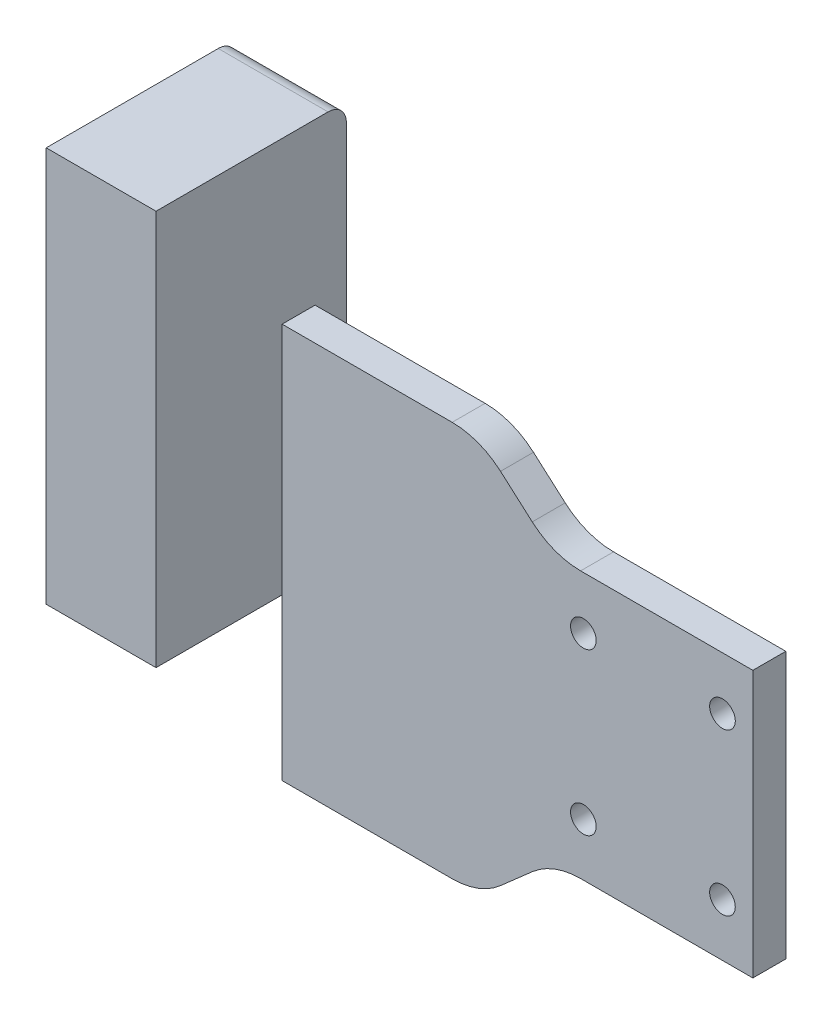
ISO-10303-21;
HEADER;
FILE_DESCRIPTION(('STEP AP214'),'2;1');
FILE_NAME('part.step','',(''),(''),'','','');
FILE_SCHEMA(('AUTOMOTIVE_DESIGN { 1 0 10303 214 1 1 1 1 }'));
ENDSEC;
DATA;
#1=APPLICATION_CONTEXT('core data for automotive mechanical design processes');
#2=APPLICATION_PROTOCOL_DEFINITION('international standard','automotive_design',2000,#1);
#3=PRODUCT_CONTEXT('',#1,'mechanical');
#4=PRODUCT('Part','Part','',(#3));
#5=PRODUCT_RELATED_PRODUCT_CATEGORY('part','',(#4));
#6=PRODUCT_DEFINITION_FORMATION('','',#4);
#7=PRODUCT_DEFINITION_CONTEXT('part definition',#1,'design');
#8=PRODUCT_DEFINITION('design','',#6,#7);
#9=PRODUCT_DEFINITION_SHAPE('','',#8);
#10=(LENGTH_UNIT() NAMED_UNIT(*) SI_UNIT(.MILLI.,.METRE.));
#11=(NAMED_UNIT(*) PLANE_ANGLE_UNIT() SI_UNIT($,.RADIAN.));
#12=(NAMED_UNIT(*) SI_UNIT($,.STERADIAN.) SOLID_ANGLE_UNIT());
#13=UNCERTAINTY_MEASURE_WITH_UNIT(LENGTH_MEASURE(1.E-05),#10,'distance_accuracy_value','');
#14=(GEOMETRIC_REPRESENTATION_CONTEXT(3) GLOBAL_UNCERTAINTY_ASSIGNED_CONTEXT((#13)) GLOBAL_UNIT_ASSIGNED_CONTEXT((#10,
#11,#12)) REPRESENTATION_CONTEXT('',''));
#15=CARTESIAN_POINT('',(0.,0.,0.));
#16=DIRECTION('',(0.,0.,1.));
#17=DIRECTION('',(1.,0.,0.));
#18=AXIS2_PLACEMENT_3D('',#15,#16,#17);
#19=CARTESIAN_POINT('',(-87.376376322438,27.2465284170096,-26.));
#20=DIRECTION('',(-1.,0.,0.));
#21=DIRECTION('',(0.,-1.,0.));
#22=AXIS2_PLACEMENT_3D('',#19,#20,#21);
#23=PLANE('',#22);
#24=DIRECTION('',(0.,0.,1.));
#25=VECTOR('',#24,1.);
#26=CARTESIAN_POINT('',(-87.376376322438,27.2465284170096,-26.));
#27=LINE('',#26,#25);
#28=CARTESIAN_POINT('',(-87.376376322438,27.2465284170096,-23.5));
#29=VERTEX_POINT('',#28);
#30=CARTESIAN_POINT('',(-87.376376322438,27.2465284170096,0.));
#31=VERTEX_POINT('',#30);
#32=EDGE_CURVE('E130',#29,#31,#27,.T.);
#33=ORIENTED_EDGE('',*,*,#32,.F.);
#34=CARTESIAN_POINT('',(-87.376376322438,24.7465284170096,-23.5));
#35=DIRECTION('',(-1.,0.,0.));
#36=DIRECTION('',(0.,-1.,0.));
#37=AXIS2_PLACEMENT_3D('',#34,#35,#36);
#38=CIRCLE('',#37,2.5);
#39=CARTESIAN_POINT('',(-87.376376322438,24.7465284170096,-26.));
#40=VERTEX_POINT('',#39);
#41=EDGE_CURVE('E139',#29,#40,#38,.T.);
#42=ORIENTED_EDGE('',*,*,#41,.T.);
#43=DIRECTION('',(0.,-1.,0.));
#44=VECTOR('',#43,1.);
#45=CARTESIAN_POINT('',(-87.376376322438,27.2465284170096,-26.));
#46=LINE('',#45,#44);
#47=CARTESIAN_POINT('',(-87.376376322438,-24.2534715829904,-26.));
#48=VERTEX_POINT('',#47);
#49=EDGE_CURVE('E129',#40,#48,#46,.T.);
#50=ORIENTED_EDGE('',*,*,#49,.T.);
#51=CARTESIAN_POINT('',(-87.376376322438,-24.2534715829904,-23.5));
#52=DIRECTION('',(-1.,0.,0.));
#53=DIRECTION('',(0.,-1.,0.));
#54=AXIS2_PLACEMENT_3D('',#51,#52,#53);
#55=CIRCLE('',#54,2.5);
#56=CARTESIAN_POINT('',(-87.376376322438,-26.7534715829904,-23.5));
#57=VERTEX_POINT('',#56);
#58=EDGE_CURVE('E106',#48,#57,#55,.T.);
#59=ORIENTED_EDGE('',*,*,#58,.T.);
#60=DIRECTION('',(0.,0.,1.));
#61=VECTOR('',#60,1.);
#62=CARTESIAN_POINT('',(-87.376376322438,-26.7534715829904,-26.));
#63=LINE('',#62,#61);
#64=CARTESIAN_POINT('',(-87.376376322438,-26.7534715829904,0.));
#65=VERTEX_POINT('',#64);
#66=EDGE_CURVE('E98',#57,#65,#63,.T.);
#67=ORIENTED_EDGE('',*,*,#66,.T.);
#68=DIRECTION('',(0.,-1.,0.));
#69=VECTOR('',#68,1.);
#70=CARTESIAN_POINT('',(-87.376376322438,27.2465284170096,0.));
#71=LINE('',#70,#69);
#72=EDGE_CURVE('E102',#31,#65,#71,.T.);
#73=ORIENTED_EDGE('',*,*,#72,.F.);
#74=EDGE_LOOP('',(#33,#42,#50,#59,#67,#73));
#75=FACE_BOUND('',#74,.T.);
#76=ADVANCED_FACE('F43',(#75),#23,.T.);
#77=CARTESIAN_POINT('',(-87.376376322438,27.2465284170096,-26.));
#78=DIRECTION('',(0.,1.,0.));
#79=DIRECTION('',(-1.,0.,0.));
#80=AXIS2_PLACEMENT_3D('',#77,#78,#79);
#81=PLANE('',#80);
#82=DIRECTION('',(0.,0.,1.));
#83=VECTOR('',#82,1.);
#84=CARTESIAN_POINT('',(-72.376376322438,27.2465284170096,-26.));
#85=LINE('',#84,#83);
#86=CARTESIAN_POINT('',(-72.376376322438,27.2465284170096,-23.5));
#87=VERTEX_POINT('',#86);
#88=CARTESIAN_POINT('',(-72.376376322438,27.2465284170096,0.));
#89=VERTEX_POINT('',#88);
#90=EDGE_CURVE('E133',#87,#89,#85,.T.);
#91=ORIENTED_EDGE('',*,*,#90,.F.);
#92=DIRECTION('',(-1.,0.,0.));
#93=VECTOR('',#92,1.);
#94=CARTESIAN_POINT('',(-87.376376322438,27.2465284170096,-23.5));
#95=LINE('',#94,#93);
#96=EDGE_CURVE('E132',#87,#29,#95,.T.);
#97=ORIENTED_EDGE('',*,*,#96,.T.);
#98=ORIENTED_EDGE('',*,*,#32,.T.);
#99=DIRECTION('',(-1.,0.,0.));
#100=VECTOR('',#99,1.);
#101=CARTESIAN_POINT('',(-87.376376322438,27.2465284170096,0.));
#102=LINE('',#101,#100);
#103=EDGE_CURVE('E122',#89,#31,#102,.T.);
#104=ORIENTED_EDGE('',*,*,#103,.F.);
#105=EDGE_LOOP('',(#91,#97,#98,#104));
#106=FACE_BOUND('',#105,.T.);
#107=ADVANCED_FACE('F151',(#106),#81,.T.);
#108=CARTESIAN_POINT('',(-72.376376322438,27.2465284170096,-26.));
#109=DIRECTION('',(1.,0.,0.));
#110=DIRECTION('',(0.,0.,-1.));
#111=AXIS2_PLACEMENT_3D('',#108,#109,#110);
#112=PLANE('',#111);
#113=DIRECTION('',(0.,1.,0.));
#114=VECTOR('',#113,1.);
#115=CARTESIAN_POINT('',(-72.376376322438,27.2465284170096,-26.));
#116=LINE('',#115,#114);
#117=CARTESIAN_POINT('',(-72.376376322438,-24.2534715829904,-26.));
#118=VERTEX_POINT('',#117);
#119=CARTESIAN_POINT('',(-72.376376322438,24.7465284170096,-26.));
#120=VERTEX_POINT('',#119);
#121=EDGE_CURVE('E109',#118,#120,#116,.T.);
#122=ORIENTED_EDGE('',*,*,#121,.T.);
#123=CARTESIAN_POINT('',(-72.376376322438,24.7465284170096,-23.5));
#124=DIRECTION('',(1.,0.,0.));
#125=DIRECTION('',(0.,0.,-1.));
#126=AXIS2_PLACEMENT_3D('',#123,#124,#125);
#127=CIRCLE('',#126,2.5);
#128=EDGE_CURVE('E51',#120,#87,#127,.T.);
#129=ORIENTED_EDGE('',*,*,#128,.T.);
#130=ORIENTED_EDGE('',*,*,#90,.T.);
#131=DIRECTION('',(0.,1.,0.));
#132=VECTOR('',#131,1.);
#133=CARTESIAN_POINT('',(-72.376376322438,27.2465284170096,0.));
#134=LINE('',#133,#132);
#135=CARTESIAN_POINT('',(-72.376376322438,-26.7534715829904,0.));
#136=VERTEX_POINT('',#135);
#137=EDGE_CURVE('E118',#136,#89,#134,.T.);
#138=ORIENTED_EDGE('',*,*,#137,.F.);
#139=DIRECTION('',(0.,0.,1.));
#140=VECTOR('',#139,1.);
#141=CARTESIAN_POINT('',(-72.376376322438,-26.7534715829904,-26.));
#142=LINE('',#141,#140);
#143=CARTESIAN_POINT('',(-72.376376322438,-26.7534715829904,-23.5));
#144=VERTEX_POINT('',#143);
#145=EDGE_CURVE('E108',#144,#136,#142,.T.);
#146=ORIENTED_EDGE('',*,*,#145,.F.);
#147=CARTESIAN_POINT('',(-72.376376322438,-24.2534715829904,-23.5));
#148=DIRECTION('',(1.,0.,0.));
#149=DIRECTION('',(0.,0.,-1.));
#150=AXIS2_PLACEMENT_3D('',#147,#148,#149);
#151=CIRCLE('',#150,2.5);
#152=EDGE_CURVE('E58',#144,#118,#151,.T.);
#153=ORIENTED_EDGE('',*,*,#152,.T.);
#154=EDGE_LOOP('',(#122,#129,#130,#138,#146,#153));
#155=FACE_BOUND('',#154,.T.);
#156=ADVANCED_FACE('F147',(#155),#112,.T.);
#157=CARTESIAN_POINT('',(-87.376376322438,-26.7534715829904,-26.));
#158=DIRECTION('',(0.,-1.,0.));
#159=DIRECTION('',(0.,0.,-1.));
#160=AXIS2_PLACEMENT_3D('',#157,#158,#159);
#161=PLANE('',#160);
#162=ORIENTED_EDGE('',*,*,#66,.F.);
#163=DIRECTION('',(1.,0.,0.));
#164=VECTOR('',#163,1.);
#165=CARTESIAN_POINT('',(-72.376376322438,-26.7534715829904,-23.5));
#166=LINE('',#165,#164);
#167=EDGE_CURVE('E12',#57,#144,#166,.T.);
#168=ORIENTED_EDGE('',*,*,#167,.T.);
#169=ORIENTED_EDGE('',*,*,#145,.T.);
#170=DIRECTION('',(1.,0.,0.));
#171=VECTOR('',#170,1.);
#172=CARTESIAN_POINT('',(-87.376376322438,-26.7534715829904,0.));
#173=LINE('',#172,#171);
#174=EDGE_CURVE('E112',#65,#136,#173,.T.);
#175=ORIENTED_EDGE('',*,*,#174,.F.);
#176=EDGE_LOOP('',(#162,#168,#169,#175));
#177=FACE_BOUND('',#176,.T.);
#178=ADVANCED_FACE('F113',(#177),#161,.T.);
#179=CARTESIAN_POINT('',(0.,0.,-26.));
#180=DIRECTION('',(0.,0.,1.));
#181=DIRECTION('',(1.,0.,0.));
#182=AXIS2_PLACEMENT_3D('',#179,#180,#181);
#183=PLANE('',#182);
#184=ORIENTED_EDGE('',*,*,#49,.F.);
#185=DIRECTION('',(-1.,0.,0.));
#186=VECTOR('',#185,1.);
#187=CARTESIAN_POINT('',(-72.376376322438,24.7465284170096,-26.));
#188=LINE('',#187,#186);
#189=EDGE_CURVE('E65',#40,#120,#188,.F.);
#190=ORIENTED_EDGE('',*,*,#189,.T.);
#191=ORIENTED_EDGE('',*,*,#121,.F.);
#192=DIRECTION('',(1.,0.,0.));
#193=VECTOR('',#192,1.);
#194=CARTESIAN_POINT('',(-87.376376322438,-24.2534715829904,-26.));
#195=LINE('',#194,#193);
#196=EDGE_CURVE('E141',#118,#48,#195,.F.);
#197=ORIENTED_EDGE('',*,*,#196,.T.);
#198=EDGE_LOOP('',(#184,#190,#191,#197));
#199=FACE_BOUND('',#198,.T.);
#200=ADVANCED_FACE('F153',(#199),#183,.F.);
#201=CARTESIAN_POINT('',(0.,0.,0.));
#202=DIRECTION('',(0.,0.,1.));
#203=DIRECTION('',(1.,0.,0.));
#204=AXIS2_PLACEMENT_3D('',#201,#202,#203);
#205=PLANE('',#204);
#206=ORIENTED_EDGE('',*,*,#72,.T.);
#207=ORIENTED_EDGE('',*,*,#174,.T.);
#208=ORIENTED_EDGE('',*,*,#137,.T.);
#209=ORIENTED_EDGE('',*,*,#103,.T.);
#210=EDGE_LOOP('',(#206,#207,#208,#209));
#211=FACE_BOUND('',#210,.T.);
#212=ADVANCED_FACE('F120',(#211),#205,.T.);
#213=CARTESIAN_POINT('',(-87.376376322438,24.7465284170096,-23.5));
#214=DIRECTION('',(1.,0.,0.));
#215=DIRECTION('',(0.,1.,0.));
#216=AXIS2_PLACEMENT_3D('',#213,#214,#215);
#217=CYLINDRICAL_SURFACE('',#216,2.5);
#218=ORIENTED_EDGE('',*,*,#128,.F.);
#219=ORIENTED_EDGE('',*,*,#189,.F.);
#220=ORIENTED_EDGE('',*,*,#41,.F.);
#221=ORIENTED_EDGE('',*,*,#96,.F.);
#222=EDGE_LOOP('',(#218,#219,#220,#221));
#223=FACE_BOUND('',#222,.T.);
#224=ADVANCED_FACE('F152',(#223),#217,.T.);
#225=CARTESIAN_POINT('',(-87.376376322438,-24.2534715829904,-23.5));
#226=DIRECTION('',(-1.,0.,0.));
#227=DIRECTION('',(0.,0.,1.));
#228=AXIS2_PLACEMENT_3D('',#225,#226,#227);
#229=CYLINDRICAL_SURFACE('',#228,2.5);
#230=ORIENTED_EDGE('',*,*,#58,.F.);
#231=ORIENTED_EDGE('',*,*,#196,.F.);
#232=ORIENTED_EDGE('',*,*,#152,.F.);
#233=ORIENTED_EDGE('',*,*,#167,.F.);
#234=EDGE_LOOP('',(#230,#231,#232,#233));
#235=FACE_BOUND('',#234,.T.);
#236=ADVANCED_FACE('F45',(#235),#229,.T.);
#237=CLOSED_SHELL('',(#76,#107,#156,#178,#200,#212,#224,#236));
#238=MANIFOLD_SOLID_BREP('B2',#237);
#239=CARTESIAN_POINT('',(0.,0.,4.5));
#240=DIRECTION('',(0.,0.,-1.));
#241=DIRECTION('',(-1.,0.,0.));
#242=AXIS2_PLACEMENT_3D('',#239,#240,#241);
#243=PLANE('',#242);
#244=DIRECTION('',(1.,0.,0.));
#245=VECTOR('',#244,1.);
#246=CARTESIAN_POINT('',(-23.65,-27.,4.5));
#247=LINE('',#246,#245);
#248=CARTESIAN_POINT('',(-50.65,-27.,4.5));
#249=VERTEX_POINT('',#248);
#250=CARTESIAN_POINT('',(-27.4234780048606,-27.,4.5));
#251=VERTEX_POINT('',#250);
#252=EDGE_CURVE('E389',#249,#251,#247,.T.);
#253=ORIENTED_EDGE('',*,*,#252,.T.);
#254=CARTESIAN_POINT('',(-27.4234780048606,-17.,4.5));
#255=DIRECTION('',(0.,0.,-1.));
#256=DIRECTION('',(-1.,0.,0.));
#257=AXIS2_PLACEMENT_3D('',#254,#255,#256);
#258=CIRCLE('',#257,10.);
#259=CARTESIAN_POINT('',(-20.8171990559404,-24.5071351692275,4.5));
#260=VERTEX_POINT('',#259);
#261=EDGE_CURVE('E352',#251,#260,#258,.F.);
#262=ORIENTED_EDGE('',*,*,#261,.T.);
#263=DIRECTION('',(0.750713516922756,0.660627894892024,0.));
#264=VECTOR('',#263,1.);
#265=CARTESIAN_POINT('',(-13.65,-18.2,4.5));
#266=LINE('',#265,#264);
#267=CARTESIAN_POINT('',(-16.4828009440596,-20.6928648307724,4.5));
#268=VERTEX_POINT('',#267);
#269=EDGE_CURVE('E391',#260,#268,#266,.T.);
#270=ORIENTED_EDGE('',*,*,#269,.T.);
#271=CARTESIAN_POINT('',(-9.87652199513936,-28.2,4.5));
#272=DIRECTION('',(0.,0.,-1.));
#273=DIRECTION('',(-1.,0.,0.));
#274=AXIS2_PLACEMENT_3D('',#271,#272,#273);
#275=CIRCLE('',#274,10.);
#276=CARTESIAN_POINT('',(-9.87652199513936,-18.2,4.5));
#277=VERTEX_POINT('',#276);
#278=EDGE_CURVE('E234',#268,#277,#275,.T.);
#279=ORIENTED_EDGE('',*,*,#278,.T.);
#280=DIRECTION('',(1.,0.,0.));
#281=VECTOR('',#280,1.);
#282=CARTESIAN_POINT('',(-13.65,-18.2,4.5));
#283=LINE('',#282,#281);
#284=CARTESIAN_POINT('',(13.65,-18.2,4.5));
#285=VERTEX_POINT('',#284);
#286=EDGE_CURVE('E324',#277,#285,#283,.T.);
#287=ORIENTED_EDGE('',*,*,#286,.T.);
#288=DIRECTION('',(0.,1.,0.));
#289=VECTOR('',#288,1.);
#290=CARTESIAN_POINT('',(13.65,-18.2,4.5));
#291=LINE('',#290,#289);
#292=CARTESIAN_POINT('',(13.65,18.2,4.5));
#293=VERTEX_POINT('',#292);
#294=EDGE_CURVE('E319',#285,#293,#291,.T.);
#295=ORIENTED_EDGE('',*,*,#294,.T.);
#296=DIRECTION('',(-1.,0.,0.));
#297=VECTOR('',#296,1.);
#298=CARTESIAN_POINT('',(-13.65,18.2,4.5));
#299=LINE('',#298,#297);
#300=CARTESIAN_POINT('',(-9.87652199513936,18.2,4.5));
#301=VERTEX_POINT('',#300);
#302=EDGE_CURVE('E308',#293,#301,#299,.T.);
#303=ORIENTED_EDGE('',*,*,#302,.T.);
#304=CARTESIAN_POINT('',(-9.87652199513936,28.2,4.5));
#305=DIRECTION('',(0.,0.,-1.));
#306=DIRECTION('',(-1.,0.,0.));
#307=AXIS2_PLACEMENT_3D('',#304,#305,#306);
#308=CIRCLE('',#307,10.);
#309=CARTESIAN_POINT('',(-16.4828009440596,20.6928648307725,4.5));
#310=VERTEX_POINT('',#309);
#311=EDGE_CURVE('E41',#301,#310,#308,.T.);
#312=ORIENTED_EDGE('',*,*,#311,.T.);
#313=DIRECTION('',(-0.750713516922755,0.660627894892025,0.));
#314=VECTOR('',#313,1.);
#315=CARTESIAN_POINT('',(-13.65,18.2,4.5));
#316=LINE('',#315,#314);
#317=CARTESIAN_POINT('',(-20.8171990559404,24.5071351692276,4.5));
#318=VERTEX_POINT('',#317);
#319=EDGE_CURVE('E318',#310,#318,#316,.T.);
#320=ORIENTED_EDGE('',*,*,#319,.T.);
#321=CARTESIAN_POINT('',(-27.4234780048607,17.,4.5));
#322=DIRECTION('',(0.,0.,-1.));
#323=DIRECTION('',(-1.,0.,0.));
#324=AXIS2_PLACEMENT_3D('',#321,#322,#323);
#325=CIRCLE('',#324,10.);
#326=CARTESIAN_POINT('',(-27.4234780048607,27.,4.5));
#327=VERTEX_POINT('',#326);
#328=EDGE_CURVE('E241',#318,#327,#325,.F.);
#329=ORIENTED_EDGE('',*,*,#328,.T.);
#330=DIRECTION('',(-1.,0.,0.));
#331=VECTOR('',#330,1.);
#332=CARTESIAN_POINT('',(-23.65,27.,4.5));
#333=LINE('',#332,#331);
#334=CARTESIAN_POINT('',(-50.65,27.,4.5));
#335=VERTEX_POINT('',#334);
#336=EDGE_CURVE('E383',#327,#335,#333,.T.);
#337=ORIENTED_EDGE('',*,*,#336,.T.);
#338=DIRECTION('',(0.,-1.,0.));
#339=VECTOR('',#338,1.);
#340=CARTESIAN_POINT('',(-50.65,27.,4.5));
#341=LINE('',#340,#339);
#342=EDGE_CURVE('E385',#335,#249,#341,.T.);
#343=ORIENTED_EDGE('',*,*,#342,.T.);
#344=EDGE_LOOP('',(#253,#262,#270,#279,#287,#295,#303,#312,#320,#329,#337,#343));
#345=FACE_BOUND('',#344,.T.);
#346=CARTESIAN_POINT('',(-9.5,11.,4.5));
#347=DIRECTION('',(0.,0.,1.));
#348=DIRECTION('',(1.,0.,0.));
#349=AXIS2_PLACEMENT_3D('',#346,#347,#348);
#350=CIRCLE('',#349,1.75);
#351=CARTESIAN_POINT('',(-7.75,11.,4.5));
#352=VERTEX_POINT('',#351);
#353=EDGE_CURVE('E395',#352,#352,#350,.T.);
#354=ORIENTED_EDGE('',*,*,#353,.F.);
#355=EDGE_LOOP('',(#354));
#356=FACE_BOUND('',#355,.T.);
#357=CARTESIAN_POINT('',(9.49999999999999,11.,4.5));
#358=DIRECTION('',(0.,0.,1.));
#359=DIRECTION('',(-1.,0.,0.));
#360=AXIS2_PLACEMENT_3D('',#357,#358,#359);
#361=CIRCLE('',#360,1.75);
#362=CARTESIAN_POINT('',(7.74999999999999,11.,4.5));
#363=VERTEX_POINT('',#362);
#364=EDGE_CURVE('E486',#363,#363,#361,.T.);
#365=ORIENTED_EDGE('',*,*,#364,.F.);
#366=EDGE_LOOP('',(#365));
#367=FACE_BOUND('',#366,.T.);
#368=CARTESIAN_POINT('',(-9.5,-11.,4.5));
#369=DIRECTION('',(0.,0.,1.));
#370=DIRECTION('',(-1.,0.,0.));
#371=AXIS2_PLACEMENT_3D('',#368,#369,#370);
#372=CIRCLE('',#371,1.75);
#373=CARTESIAN_POINT('',(-11.25,-11.,4.5));
#374=VERTEX_POINT('',#373);
#375=EDGE_CURVE('E480',#374,#374,#372,.T.);
#376=ORIENTED_EDGE('',*,*,#375,.F.);
#377=EDGE_LOOP('',(#376));
#378=FACE_BOUND('',#377,.T.);
#379=CARTESIAN_POINT('',(9.49999999999999,-11.,4.5));
#380=DIRECTION('',(0.,0.,1.));
#381=DIRECTION('',(1.,0.,0.));
#382=AXIS2_PLACEMENT_3D('',#379,#380,#381);
#383=CIRCLE('',#382,1.75);
#384=CARTESIAN_POINT('',(11.25,-11.,4.5));
#385=VERTEX_POINT('',#384);
#386=EDGE_CURVE('E471',#385,#385,#383,.T.);
#387=ORIENTED_EDGE('',*,*,#386,.F.);
#388=EDGE_LOOP('',(#387));
#389=FACE_BOUND('',#388,.T.);
#390=ADVANCED_FACE('F219',(#345,#356,#367,#378,#389),#243,.F.);
#391=CARTESIAN_POINT('',(0.,0.,0.));
#392=DIRECTION('',(0.,0.,-1.));
#393=DIRECTION('',(-1.,0.,0.));
#394=AXIS2_PLACEMENT_3D('',#391,#392,#393);
#395=PLANE('',#394);
#396=CARTESIAN_POINT('',(-9.5,-11.,0.));
#397=DIRECTION('',(0.,0.,1.));
#398=DIRECTION('',(-1.,0.,0.));
#399=AXIS2_PLACEMENT_3D('',#396,#397,#398);
#400=CIRCLE('',#399,1.75);
#401=CARTESIAN_POINT('',(-11.25,-11.,0.));
#402=VERTEX_POINT('',#401);
#403=EDGE_CURVE('E477',#402,#402,#400,.T.);
#404=ORIENTED_EDGE('',*,*,#403,.T.);
#405=EDGE_LOOP('',(#404));
#406=FACE_BOUND('',#405,.T.);
#407=CARTESIAN_POINT('',(-9.5,11.,0.));
#408=DIRECTION('',(0.,0.,1.));
#409=DIRECTION('',(1.,0.,0.));
#410=AXIS2_PLACEMENT_3D('',#407,#408,#409);
#411=CIRCLE('',#410,1.75);
#412=CARTESIAN_POINT('',(-7.75,11.,0.));
#413=VERTEX_POINT('',#412);
#414=EDGE_CURVE('E489',#413,#413,#411,.T.);
#415=ORIENTED_EDGE('',*,*,#414,.T.);
#416=EDGE_LOOP('',(#415));
#417=FACE_BOUND('',#416,.T.);
#418=DIRECTION('',(0.750713516922756,0.660627894892024,0.));
#419=VECTOR('',#418,1.);
#420=CARTESIAN_POINT('',(-13.65,-18.2,0.));
#421=LINE('',#420,#419);
#422=CARTESIAN_POINT('',(-20.8171990559404,-24.5071351692275,0.));
#423=VERTEX_POINT('',#422);
#424=CARTESIAN_POINT('',(-16.4828009440596,-20.6928648307724,0.));
#425=VERTEX_POINT('',#424);
#426=EDGE_CURVE('E405',#423,#425,#421,.T.);
#427=ORIENTED_EDGE('',*,*,#426,.F.);
#428=CARTESIAN_POINT('',(-27.4234780048606,-17.,0.));
#429=DIRECTION('',(0.,0.,-1.));
#430=DIRECTION('',(-1.,0.,0.));
#431=AXIS2_PLACEMENT_3D('',#428,#429,#430);
#432=CIRCLE('',#431,10.);
#433=CARTESIAN_POINT('',(-27.4234780048606,-27.,0.));
#434=VERTEX_POINT('',#433);
#435=EDGE_CURVE('E347',#423,#434,#432,.T.);
#436=ORIENTED_EDGE('',*,*,#435,.T.);
#437=DIRECTION('',(1.,0.,0.));
#438=VECTOR('',#437,1.);
#439=CARTESIAN_POINT('',(-23.65,-27.,0.));
#440=LINE('',#439,#438);
#441=CARTESIAN_POINT('',(-50.65,-27.,0.));
#442=VERTEX_POINT('',#441);
#443=EDGE_CURVE('E402',#442,#434,#440,.T.);
#444=ORIENTED_EDGE('',*,*,#443,.F.);
#445=DIRECTION('',(0.,-1.,0.));
#446=VECTOR('',#445,1.);
#447=CARTESIAN_POINT('',(-50.65,27.,0.));
#448=LINE('',#447,#446);
#449=CARTESIAN_POINT('',(-50.65,27.,0.));
#450=VERTEX_POINT('',#449);
#451=EDGE_CURVE('E400',#450,#442,#448,.T.);
#452=ORIENTED_EDGE('',*,*,#451,.F.);
#453=DIRECTION('',(-1.,0.,0.));
#454=VECTOR('',#453,1.);
#455=CARTESIAN_POINT('',(-23.65,27.,0.));
#456=LINE('',#455,#454);
#457=CARTESIAN_POINT('',(-27.4234780048607,27.,0.));
#458=VERTEX_POINT('',#457);
#459=EDGE_CURVE('E398',#458,#450,#456,.T.);
#460=ORIENTED_EDGE('',*,*,#459,.F.);
#461=CARTESIAN_POINT('',(-27.4234780048607,17.,0.));
#462=DIRECTION('',(0.,0.,-1.));
#463=DIRECTION('',(-1.,0.,0.));
#464=AXIS2_PLACEMENT_3D('',#461,#462,#463);
#465=CIRCLE('',#464,10.);
#466=CARTESIAN_POINT('',(-20.8171990559404,24.5071351692276,0.));
#467=VERTEX_POINT('',#466);
#468=EDGE_CURVE('E345',#458,#467,#465,.T.);
#469=ORIENTED_EDGE('',*,*,#468,.T.);
#470=DIRECTION('',(-0.750713516922755,0.660627894892025,0.));
#471=VECTOR('',#470,1.);
#472=CARTESIAN_POINT('',(-13.65,18.2,0.));
#473=LINE('',#472,#471);
#474=CARTESIAN_POINT('',(-16.4828009440596,20.6928648307725,0.));
#475=VERTEX_POINT('',#474);
#476=EDGE_CURVE('E375',#475,#467,#473,.T.);
#477=ORIENTED_EDGE('',*,*,#476,.F.);
#478=CARTESIAN_POINT('',(-9.87652199513936,28.2,0.));
#479=DIRECTION('',(0.,0.,-1.));
#480=DIRECTION('',(-1.,0.,0.));
#481=AXIS2_PLACEMENT_3D('',#478,#479,#480);
#482=CIRCLE('',#481,10.);
#483=CARTESIAN_POINT('',(-9.87652199513936,18.2,0.));
#484=VERTEX_POINT('',#483);
#485=EDGE_CURVE('E227',#475,#484,#482,.F.);
#486=ORIENTED_EDGE('',*,*,#485,.T.);
#487=DIRECTION('',(-1.,0.,0.));
#488=VECTOR('',#487,1.);
#489=CARTESIAN_POINT('',(-13.65,18.2,0.));
#490=LINE('',#489,#488);
#491=CARTESIAN_POINT('',(13.65,18.2,0.));
#492=VERTEX_POINT('',#491);
#493=EDGE_CURVE('E373',#492,#484,#490,.T.);
#494=ORIENTED_EDGE('',*,*,#493,.F.);
#495=DIRECTION('',(0.,1.,0.));
#496=VECTOR('',#495,1.);
#497=CARTESIAN_POINT('',(13.65,-18.2,0.));
#498=LINE('',#497,#496);
#499=CARTESIAN_POINT('',(13.65,-18.2,0.));
#500=VERTEX_POINT('',#499);
#501=EDGE_CURVE('E332',#500,#492,#498,.T.);
#502=ORIENTED_EDGE('',*,*,#501,.F.);
#503=DIRECTION('',(1.,0.,0.));
#504=VECTOR('',#503,1.);
#505=CARTESIAN_POINT('',(-13.65,-18.2,0.));
#506=LINE('',#505,#504);
#507=CARTESIAN_POINT('',(-9.87652199513936,-18.2,0.));
#508=VERTEX_POINT('',#507);
#509=EDGE_CURVE('E328',#508,#500,#506,.T.);
#510=ORIENTED_EDGE('',*,*,#509,.F.);
#511=CARTESIAN_POINT('',(-9.87652199513936,-28.2,0.));
#512=DIRECTION('',(0.,0.,-1.));
#513=DIRECTION('',(-1.,0.,0.));
#514=AXIS2_PLACEMENT_3D('',#511,#512,#513);
#515=CIRCLE('',#514,10.);
#516=EDGE_CURVE('E366',#508,#425,#515,.F.);
#517=ORIENTED_EDGE('',*,*,#516,.T.);
#518=EDGE_LOOP('',(#427,#436,#444,#452,#460,#469,#477,#486,#494,#502,#510,#517));
#519=FACE_BOUND('',#518,.T.);
#520=CARTESIAN_POINT('',(9.49999999999999,11.,0.));
#521=DIRECTION('',(0.,0.,1.));
#522=DIRECTION('',(-1.,0.,0.));
#523=AXIS2_PLACEMENT_3D('',#520,#521,#522);
#524=CIRCLE('',#523,1.75);
#525=CARTESIAN_POINT('',(7.74999999999999,11.,0.));
#526=VERTEX_POINT('',#525);
#527=EDGE_CURVE('E483',#526,#526,#524,.T.);
#528=ORIENTED_EDGE('',*,*,#527,.T.);
#529=EDGE_LOOP('',(#528));
#530=FACE_BOUND('',#529,.T.);
#531=CARTESIAN_POINT('',(9.49999999999999,-11.,0.));
#532=DIRECTION('',(0.,0.,1.));
#533=DIRECTION('',(1.,0.,0.));
#534=AXIS2_PLACEMENT_3D('',#531,#532,#533);
#535=CIRCLE('',#534,1.75);
#536=CARTESIAN_POINT('',(11.25,-11.,0.));
#537=VERTEX_POINT('',#536);
#538=EDGE_CURVE('E474',#537,#537,#535,.T.);
#539=ORIENTED_EDGE('',*,*,#538,.T.);
#540=EDGE_LOOP('',(#539));
#541=FACE_BOUND('',#540,.T.);
#542=ADVANCED_FACE('F371',(#406,#417,#519,#530,#541),#395,.T.);
#543=CARTESIAN_POINT('',(13.65,-18.2,4.5));
#544=DIRECTION('',(-1.,0.,0.));
#545=DIRECTION('',(0.,0.,1.));
#546=AXIS2_PLACEMENT_3D('',#543,#544,#545);
#547=PLANE('',#546);
#548=ORIENTED_EDGE('',*,*,#501,.T.);
#549=DIRECTION('',(0.,0.,-1.));
#550=VECTOR('',#549,1.);
#551=CARTESIAN_POINT('',(13.65,18.2,4.5));
#552=LINE('',#551,#550);
#553=EDGE_CURVE('E313',#293,#492,#552,.T.);
#554=ORIENTED_EDGE('',*,*,#553,.F.);
#555=ORIENTED_EDGE('',*,*,#294,.F.);
#556=DIRECTION('',(0.,0.,-1.));
#557=VECTOR('',#556,1.);
#558=CARTESIAN_POINT('',(13.65,-18.2,4.5));
#559=LINE('',#558,#557);
#560=EDGE_CURVE('E394',#285,#500,#559,.T.);
#561=ORIENTED_EDGE('',*,*,#560,.T.);
#562=EDGE_LOOP('',(#548,#554,#555,#561));
#563=FACE_BOUND('',#562,.T.);
#564=ADVANCED_FACE('F330',(#563),#547,.F.);
#565=CARTESIAN_POINT('',(-13.65,18.2,4.5));
#566=DIRECTION('',(0.,-1.,0.));
#567=DIRECTION('',(0.,0.,-1.));
#568=AXIS2_PLACEMENT_3D('',#565,#566,#567);
#569=PLANE('',#568);
#570=ORIENTED_EDGE('',*,*,#493,.T.);
#571=DIRECTION('',(0.,0.,-1.));
#572=VECTOR('',#571,1.);
#573=CARTESIAN_POINT('',(-9.87652199513936,18.2,4.5));
#574=LINE('',#573,#572);
#575=EDGE_CURVE('E316',#484,#301,#574,.F.);
#576=ORIENTED_EDGE('',*,*,#575,.T.);
#577=ORIENTED_EDGE('',*,*,#302,.F.);
#578=ORIENTED_EDGE('',*,*,#553,.T.);
#579=EDGE_LOOP('',(#570,#576,#577,#578));
#580=FACE_BOUND('',#579,.T.);
#581=ADVANCED_FACE('F311',(#580),#569,.F.);
#582=CARTESIAN_POINT('',(-13.65,18.2,4.5));
#583=DIRECTION('',(-0.660627894892025,-0.750713516922755,0.));
#584=DIRECTION('',(0.750713516922755,-0.660627894892025,0.));
#585=AXIS2_PLACEMENT_3D('',#582,#583,#584);
#586=PLANE('',#585);
#587=ORIENTED_EDGE('',*,*,#476,.T.);
#588=DIRECTION('',(0.,0.,-1.));
#589=VECTOR('',#588,1.);
#590=CARTESIAN_POINT('',(-20.8171990559404,24.5071351692276,4.5));
#591=LINE('',#590,#589);
#592=EDGE_CURVE('E360',#467,#318,#591,.F.);
#593=ORIENTED_EDGE('',*,*,#592,.T.);
#594=ORIENTED_EDGE('',*,*,#319,.F.);
#595=DIRECTION('',(0.,0.,-1.));
#596=VECTOR('',#595,1.);
#597=CARTESIAN_POINT('',(-16.4828009440596,20.6928648307725,0.));
#598=LINE('',#597,#596);
#599=EDGE_CURVE('E357',#310,#475,#598,.T.);
#600=ORIENTED_EDGE('',*,*,#599,.T.);
#601=EDGE_LOOP('',(#587,#593,#594,#600));
#602=FACE_BOUND('',#601,.T.);
#603=ADVANCED_FACE('F381',(#602),#586,.F.);
#604=CARTESIAN_POINT('',(-23.65,27.,4.5));
#605=DIRECTION('',(0.,-1.,0.));
#606=DIRECTION('',(1.,0.,0.));
#607=AXIS2_PLACEMENT_3D('',#604,#605,#606);
#608=PLANE('',#607);
#609=ORIENTED_EDGE('',*,*,#336,.F.);
#610=DIRECTION('',(0.,0.,-1.));
#611=VECTOR('',#610,1.);
#612=CARTESIAN_POINT('',(-27.4234780048607,27.,4.5));
#613=LINE('',#612,#611);
#614=EDGE_CURVE('E354',#327,#458,#613,.T.);
#615=ORIENTED_EDGE('',*,*,#614,.T.);
#616=ORIENTED_EDGE('',*,*,#459,.T.);
#617=DIRECTION('',(0.,0.,-1.));
#618=VECTOR('',#617,1.);
#619=CARTESIAN_POINT('',(-50.65,27.,4.5));
#620=LINE('',#619,#618);
#621=EDGE_CURVE('E334',#335,#450,#620,.T.);
#622=ORIENTED_EDGE('',*,*,#621,.F.);
#623=EDGE_LOOP('',(#609,#615,#616,#622));
#624=FACE_BOUND('',#623,.T.);
#625=ADVANCED_FACE('F563',(#624),#608,.F.);
#626=CARTESIAN_POINT('',(-50.65,27.,4.5));
#627=DIRECTION('',(1.,0.,0.));
#628=DIRECTION('',(0.,0.,-1.));
#629=AXIS2_PLACEMENT_3D('',#626,#627,#628);
#630=PLANE('',#629);
#631=ORIENTED_EDGE('',*,*,#451,.T.);
#632=DIRECTION('',(0.,0.,-1.));
#633=VECTOR('',#632,1.);
#634=CARTESIAN_POINT('',(-50.65,-27.,4.5));
#635=LINE('',#634,#633);
#636=EDGE_CURVE('E339',#249,#442,#635,.T.);
#637=ORIENTED_EDGE('',*,*,#636,.F.);
#638=ORIENTED_EDGE('',*,*,#342,.F.);
#639=ORIENTED_EDGE('',*,*,#621,.T.);
#640=EDGE_LOOP('',(#631,#637,#638,#639));
#641=FACE_BOUND('',#640,.T.);
#642=ADVANCED_FACE('F556',(#641),#630,.F.);
#643=CARTESIAN_POINT('',(-23.65,-27.,4.5));
#644=DIRECTION('',(0.,1.,0.));
#645=DIRECTION('',(-1.,0.,0.));
#646=AXIS2_PLACEMENT_3D('',#643,#644,#645);
#647=PLANE('',#646);
#648=ORIENTED_EDGE('',*,*,#443,.T.);
#649=DIRECTION('',(0.,0.,-1.));
#650=VECTOR('',#649,1.);
#651=CARTESIAN_POINT('',(-27.4234780048606,-27.,4.5));
#652=LINE('',#651,#650);
#653=EDGE_CURVE('E349',#434,#251,#652,.F.);
#654=ORIENTED_EDGE('',*,*,#653,.T.);
#655=ORIENTED_EDGE('',*,*,#252,.F.);
#656=ORIENTED_EDGE('',*,*,#636,.T.);
#657=EDGE_LOOP('',(#648,#654,#655,#656));
#658=FACE_BOUND('',#657,.T.);
#659=ADVANCED_FACE('F414',(#658),#647,.F.);
#660=CARTESIAN_POINT('',(-13.65,-18.2,4.5));
#661=DIRECTION('',(-0.660627894892024,0.750713516922756,0.));
#662=DIRECTION('',(-0.750713516922756,-0.660627894892024,0.));
#663=AXIS2_PLACEMENT_3D('',#660,#661,#662);
#664=PLANE('',#663);
#665=ORIENTED_EDGE('',*,*,#269,.F.);
#666=DIRECTION('',(0.,0.,-1.));
#667=VECTOR('',#666,1.);
#668=CARTESIAN_POINT('',(-20.8171990559404,-24.5071351692275,4.5));
#669=LINE('',#668,#667);
#670=EDGE_CURVE('E336',#260,#423,#669,.T.);
#671=ORIENTED_EDGE('',*,*,#670,.T.);
#672=ORIENTED_EDGE('',*,*,#426,.T.);
#673=DIRECTION('',(0.,0.,-1.));
#674=VECTOR('',#673,1.);
#675=CARTESIAN_POINT('',(-16.4828009440596,-20.6928648307724,4.5));
#676=LINE('',#675,#674);
#677=EDGE_CURVE('E333',#425,#268,#676,.F.);
#678=ORIENTED_EDGE('',*,*,#677,.T.);
#679=EDGE_LOOP('',(#665,#671,#672,#678));
#680=FACE_BOUND('',#679,.T.);
#681=ADVANCED_FACE('F426',(#680),#664,.F.);
#682=CARTESIAN_POINT('',(-13.65,-18.2,4.5));
#683=DIRECTION('',(0.,1.,0.));
#684=DIRECTION('',(0.,0.,1.));
#685=AXIS2_PLACEMENT_3D('',#682,#683,#684);
#686=PLANE('',#685);
#687=ORIENTED_EDGE('',*,*,#286,.F.);
#688=DIRECTION('',(0.,0.,-1.));
#689=VECTOR('',#688,1.);
#690=CARTESIAN_POINT('',(-9.87652199513936,-18.2,0.));
#691=LINE('',#690,#689);
#692=EDGE_CURVE('E362',#277,#508,#691,.T.);
#693=ORIENTED_EDGE('',*,*,#692,.T.);
#694=ORIENTED_EDGE('',*,*,#509,.T.);
#695=ORIENTED_EDGE('',*,*,#560,.F.);
#696=EDGE_LOOP('',(#687,#693,#694,#695));
#697=FACE_BOUND('',#696,.T.);
#698=ADVANCED_FACE('F433',(#697),#686,.F.);
#699=CARTESIAN_POINT('',(-9.5,11.,4.5));
#700=DIRECTION('',(0.,0.,-1.));
#701=DIRECTION('',(-1.,0.,0.));
#702=AXIS2_PLACEMENT_3D('',#699,#700,#701);
#703=CYLINDRICAL_SURFACE('',#702,1.75);
#704=ORIENTED_EDGE('',*,*,#353,.T.);
#705=EDGE_LOOP('',(#704));
#706=FACE_BOUND('',#705,.T.);
#707=ORIENTED_EDGE('',*,*,#414,.F.);
#708=EDGE_LOOP('',(#707));
#709=FACE_BOUND('',#708,.T.);
#710=ADVANCED_FACE('F435',(#706,#709),#703,.F.);
#711=CARTESIAN_POINT('',(9.49999999999999,11.,4.5));
#712=DIRECTION('',(0.,0.,-1.));
#713=DIRECTION('',(-1.,0.,0.));
#714=AXIS2_PLACEMENT_3D('',#711,#712,#713);
#715=CYLINDRICAL_SURFACE('',#714,1.75);
#716=ORIENTED_EDGE('',*,*,#364,.T.);
#717=EDGE_LOOP('',(#716));
#718=FACE_BOUND('',#717,.T.);
#719=ORIENTED_EDGE('',*,*,#527,.F.);
#720=EDGE_LOOP('',(#719));
#721=FACE_BOUND('',#720,.T.);
#722=ADVANCED_FACE('F441',(#718,#721),#715,.F.);
#723=CARTESIAN_POINT('',(-9.5,-11.,4.5));
#724=DIRECTION('',(0.,0.,-1.));
#725=DIRECTION('',(-1.,0.,0.));
#726=AXIS2_PLACEMENT_3D('',#723,#724,#725);
#727=CYLINDRICAL_SURFACE('',#726,1.75);
#728=ORIENTED_EDGE('',*,*,#375,.T.);
#729=EDGE_LOOP('',(#728));
#730=FACE_BOUND('',#729,.T.);
#731=ORIENTED_EDGE('',*,*,#403,.F.);
#732=EDGE_LOOP('',(#731));
#733=FACE_BOUND('',#732,.T.);
#734=ADVANCED_FACE('F455',(#730,#733),#727,.F.);
#735=CARTESIAN_POINT('',(9.49999999999999,-11.,4.5));
#736=DIRECTION('',(0.,0.,-1.));
#737=DIRECTION('',(-1.,0.,0.));
#738=AXIS2_PLACEMENT_3D('',#735,#736,#737);
#739=CYLINDRICAL_SURFACE('',#738,1.75);
#740=ORIENTED_EDGE('',*,*,#386,.T.);
#741=EDGE_LOOP('',(#740));
#742=FACE_BOUND('',#741,.T.);
#743=ORIENTED_EDGE('',*,*,#538,.F.);
#744=EDGE_LOOP('',(#743));
#745=FACE_BOUND('',#744,.T.);
#746=ADVANCED_FACE('F459',(#742,#745),#739,.F.);
#747=CARTESIAN_POINT('',(-27.4234780048606,-17.,4.5));
#748=DIRECTION('',(0.,0.,-1.));
#749=DIRECTION('',(-1.,0.,0.));
#750=AXIS2_PLACEMENT_3D('',#747,#748,#749);
#751=CYLINDRICAL_SURFACE('',#750,10.);
#752=ORIENTED_EDGE('',*,*,#261,.F.);
#753=ORIENTED_EDGE('',*,*,#653,.F.);
#754=ORIENTED_EDGE('',*,*,#435,.F.);
#755=ORIENTED_EDGE('',*,*,#670,.F.);
#756=EDGE_LOOP('',(#752,#753,#754,#755));
#757=FACE_BOUND('',#756,.T.);
#758=ADVANCED_FACE('F423',(#757),#751,.T.);
#759=CARTESIAN_POINT('',(-27.4234780048607,17.,4.5));
#760=DIRECTION('',(0.,0.,-1.));
#761=DIRECTION('',(-1.,0.,0.));
#762=AXIS2_PLACEMENT_3D('',#759,#760,#761);
#763=CYLINDRICAL_SURFACE('',#762,10.);
#764=ORIENTED_EDGE('',*,*,#328,.F.);
#765=ORIENTED_EDGE('',*,*,#592,.F.);
#766=ORIENTED_EDGE('',*,*,#468,.F.);
#767=ORIENTED_EDGE('',*,*,#614,.F.);
#768=EDGE_LOOP('',(#764,#765,#766,#767));
#769=FACE_BOUND('',#768,.T.);
#770=ADVANCED_FACE('F466',(#769),#763,.T.);
#771=CARTESIAN_POINT('',(-9.87652199513936,-28.2,4.5));
#772=DIRECTION('',(0.,0.,1.));
#773=DIRECTION('',(1.,0.,0.));
#774=AXIS2_PLACEMENT_3D('',#771,#772,#773);
#775=CYLINDRICAL_SURFACE('',#774,10.);
#776=ORIENTED_EDGE('',*,*,#278,.F.);
#777=ORIENTED_EDGE('',*,*,#677,.F.);
#778=ORIENTED_EDGE('',*,*,#516,.F.);
#779=ORIENTED_EDGE('',*,*,#692,.F.);
#780=EDGE_LOOP('',(#776,#777,#778,#779));
#781=FACE_BOUND('',#780,.T.);
#782=ADVANCED_FACE('F430',(#781),#775,.F.);
#783=CARTESIAN_POINT('',(-9.87652199513936,28.2,4.5));
#784=DIRECTION('',(0.,0.,1.));
#785=DIRECTION('',(1.,0.,0.));
#786=AXIS2_PLACEMENT_3D('',#783,#784,#785);
#787=CYLINDRICAL_SURFACE('',#786,10.);
#788=ORIENTED_EDGE('',*,*,#311,.F.);
#789=ORIENTED_EDGE('',*,*,#575,.F.);
#790=ORIENTED_EDGE('',*,*,#485,.F.);
#791=ORIENTED_EDGE('',*,*,#599,.F.);
#792=EDGE_LOOP('',(#788,#789,#790,#791));
#793=FACE_BOUND('',#792,.T.);
#794=ADVANCED_FACE('F221',(#793),#787,.F.);
#795=CLOSED_SHELL('',(#390,#542,#564,#581,#603,#625,#642,#659,#681,#698,#710,#722,#734,#746,
#758,#770,#782,#794));
#796=MANIFOLD_SOLID_BREP('B6',#795);
#797=ADVANCED_BREP_SHAPE_REPRESENTATION('',(#18,#238,#796),#14);
#798=SHAPE_DEFINITION_REPRESENTATION(#9,#797);
ENDSEC;
END-ISO-10303-21;
